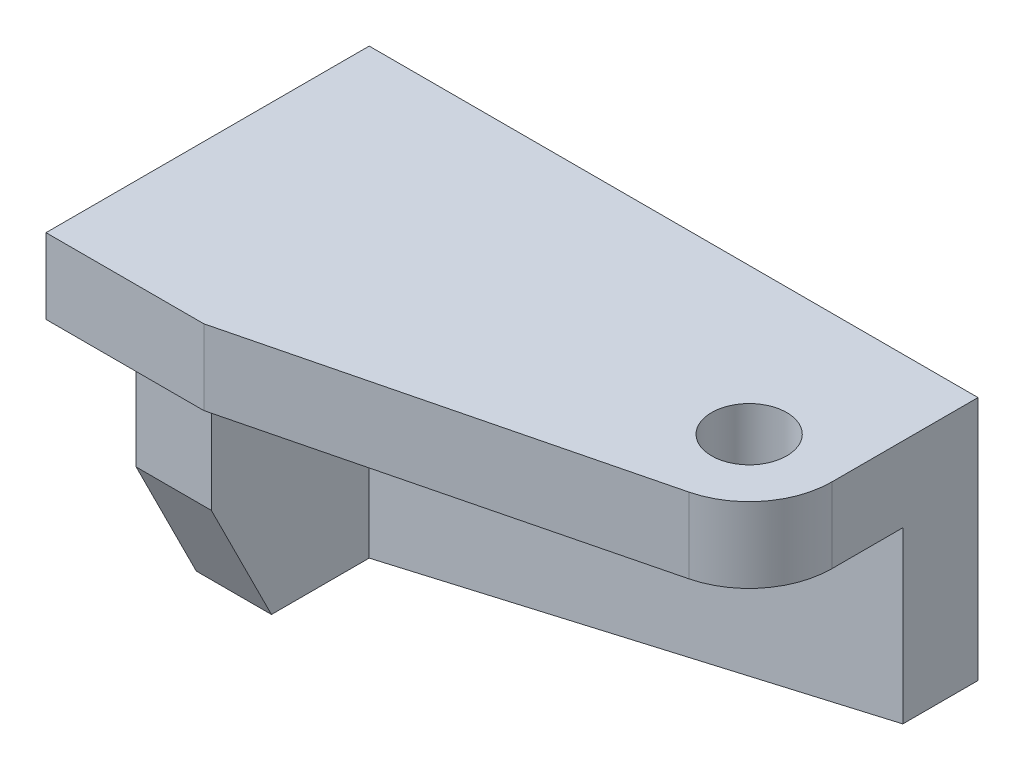
ISO-10303-21;
HEADER;
FILE_DESCRIPTION(('STEP AP214'),'2;1');
FILE_NAME('part.step','',(''),(''),'','','');
FILE_SCHEMA(('AUTOMOTIVE_DESIGN { 1 0 10303 214 1 1 1 1 }'));
ENDSEC;
DATA;
#1=APPLICATION_CONTEXT('core data for automotive mechanical design processes');
#2=APPLICATION_PROTOCOL_DEFINITION('international standard','automotive_design',2000,#1);
#3=PRODUCT_CONTEXT('',#1,'mechanical');
#4=PRODUCT('Part','Part','',(#3));
#5=PRODUCT_RELATED_PRODUCT_CATEGORY('part','',(#4));
#6=PRODUCT_DEFINITION_FORMATION('','',#4);
#7=PRODUCT_DEFINITION_CONTEXT('part definition',#1,'design');
#8=PRODUCT_DEFINITION('design','',#6,#7);
#9=PRODUCT_DEFINITION_SHAPE('','',#8);
#10=(LENGTH_UNIT() NAMED_UNIT(*) SI_UNIT(.MILLI.,.METRE.));
#11=(NAMED_UNIT(*) PLANE_ANGLE_UNIT() SI_UNIT($,.RADIAN.));
#12=(NAMED_UNIT(*) SI_UNIT($,.STERADIAN.) SOLID_ANGLE_UNIT());
#13=UNCERTAINTY_MEASURE_WITH_UNIT(LENGTH_MEASURE(1.E-05),#10,'distance_accuracy_value','');
#14=(GEOMETRIC_REPRESENTATION_CONTEXT(3) GLOBAL_UNCERTAINTY_ASSIGNED_CONTEXT((#13)) GLOBAL_UNIT_ASSIGNED_CONTEXT((#10,
#11,#12)) REPRESENTATION_CONTEXT('',''));
#15=CARTESIAN_POINT('',(0.,0.,0.));
#16=DIRECTION('',(0.,0.,1.));
#17=DIRECTION('',(1.,0.,0.));
#18=AXIS2_PLACEMENT_3D('',#15,#16,#17);
#19=CARTESIAN_POINT('',(71.,-22.6083584300847,10.));
#20=DIRECTION('',(-0.224951054343869,0.974370064785234,0.));
#21=DIRECTION('',(-0.974370064785234,-0.224951054343869,0.));
#22=AXIS2_PLACEMENT_3D('',#19,#20,#21);
#23=PLANE('',#22);
#24=DIRECTION('',(0.974370064785234,0.224951054343869,0.));
#25=VECTOR('',#24,1.);
#26=CARTESIAN_POINT('',(71.,-22.6083584300847,0.));
#27=LINE('',#26,#25);
#28=CARTESIAN_POINT('',(0.,-39.,0.));
#29=VERTEX_POINT('',#28);
#30=CARTESIAN_POINT('',(71.,-22.6083584300847,0.));
#31=VERTEX_POINT('',#30);
#32=EDGE_CURVE('E191',#29,#31,#27,.T.);
#33=ORIENTED_EDGE('',*,*,#32,.T.);
#34=DIRECTION('',(0.,0.,-1.));
#35=VECTOR('',#34,1.);
#36=CARTESIAN_POINT('',(71.,-22.6083584300847,10.));
#37=LINE('',#36,#35);
#38=CARTESIAN_POINT('',(71.,-22.6083584300847,10.));
#39=VERTEX_POINT('',#38);
#40=EDGE_CURVE('E48',#39,#31,#37,.T.);
#41=ORIENTED_EDGE('',*,*,#40,.F.);
#42=DIRECTION('',(0.974370064785234,0.224951054343869,0.));
#43=VECTOR('',#42,1.);
#44=CARTESIAN_POINT('',(71.,-22.6083584300847,10.));
#45=LINE('',#44,#43);
#46=CARTESIAN_POINT('',(0.,-39.,10.));
#47=VERTEX_POINT('',#46);
#48=EDGE_CURVE('E55',#47,#39,#45,.T.);
#49=ORIENTED_EDGE('',*,*,#48,.F.);
#50=DIRECTION('',(0.,0.,-1.));
#51=VECTOR('',#50,1.);
#52=CARTESIAN_POINT('',(0.,-39.,10.));
#53=LINE('',#52,#51);
#54=EDGE_CURVE('E11',#47,#29,#53,.T.);
#55=ORIENTED_EDGE('',*,*,#54,.T.);
#56=EDGE_LOOP('',(#33,#41,#49,#55));
#57=FACE_BOUND('',#56,.T.);
#58=ADVANCED_FACE('F39',(#57),#23,.F.);
#59=CARTESIAN_POINT('',(71.,0.,10.));
#60=DIRECTION('',(-1.,0.,0.));
#61=DIRECTION('',(0.,-1.,0.));
#62=AXIS2_PLACEMENT_3D('',#59,#60,#61);
#63=PLANE('',#62);
#64=DIRECTION('',(0.,1.,0.));
#65=VECTOR('',#64,1.);
#66=CARTESIAN_POINT('',(71.,0.,0.));
#67=LINE('',#66,#65);
#68=CARTESIAN_POINT('',(71.,10.,0.));
#69=VERTEX_POINT('',#68);
#70=EDGE_CURVE('E204',#31,#69,#67,.T.);
#71=ORIENTED_EDGE('',*,*,#70,.T.);
#72=DIRECTION('',(0.,0.,1.));
#73=VECTOR('',#72,1.);
#74=CARTESIAN_POINT('',(71.,10.,0.));
#75=LINE('',#74,#73);
#76=CARTESIAN_POINT('',(71.,10.,19.4461779378352));
#77=VERTEX_POINT('',#76);
#78=EDGE_CURVE('E135',#69,#77,#75,.T.);
#79=ORIENTED_EDGE('',*,*,#78,.T.);
#80=DIRECTION('',(0.,-1.,0.));
#81=VECTOR('',#80,1.);
#82=CARTESIAN_POINT('',(71.,10.,19.4461779378352));
#83=LINE('',#82,#81);
#84=CARTESIAN_POINT('',(71.,0.,19.4461779378352));
#85=VERTEX_POINT('',#84);
#86=EDGE_CURVE('E130',#77,#85,#83,.T.);
#87=ORIENTED_EDGE('',*,*,#86,.T.);
#88=DIRECTION('',(0.,0.,1.));
#89=VECTOR('',#88,1.);
#90=CARTESIAN_POINT('',(71.,0.,0.));
#91=LINE('',#90,#89);
#92=CARTESIAN_POINT('',(71.,0.,10.));
#93=VERTEX_POINT('',#92);
#94=EDGE_CURVE('E254',#93,#85,#91,.T.);
#95=ORIENTED_EDGE('',*,*,#94,.F.);
#96=DIRECTION('',(0.,1.,0.));
#97=VECTOR('',#96,1.);
#98=CARTESIAN_POINT('',(71.,0.,10.));
#99=LINE('',#98,#97);
#100=EDGE_CURVE('E207',#39,#93,#99,.T.);
#101=ORIENTED_EDGE('',*,*,#100,.F.);
#102=ORIENTED_EDGE('',*,*,#40,.T.);
#103=EDGE_LOOP('',(#71,#79,#87,#95,#101,#102));
#104=FACE_BOUND('',#103,.T.);
#105=ADVANCED_FACE('F223',(#104),#63,.F.);
#106=CARTESIAN_POINT('',(0.,0.,10.));
#107=DIRECTION('',(0.,0.,-1.));
#108=DIRECTION('',(-1.,0.,0.));
#109=AXIS2_PLACEMENT_3D('',#106,#107,#108);
#110=PLANE('',#109);
#111=DIRECTION('',(0.,-1.,0.));
#112=VECTOR('',#111,1.);
#113=CARTESIAN_POINT('',(0.,-39.,10.));
#114=LINE('',#113,#112);
#115=CARTESIAN_POINT('',(0.,0.,10.));
#116=VERTEX_POINT('',#115);
#117=EDGE_CURVE('E201',#116,#47,#114,.T.);
#118=ORIENTED_EDGE('',*,*,#117,.T.);
#119=ORIENTED_EDGE('',*,*,#48,.T.);
#120=ORIENTED_EDGE('',*,*,#100,.T.);
#121=DIRECTION('',(-1.,0.,0.));
#122=VECTOR('',#121,1.);
#123=CARTESIAN_POINT('',(0.,0.,10.));
#124=LINE('',#123,#122);
#125=EDGE_CURVE('E210',#93,#116,#124,.T.);
#126=ORIENTED_EDGE('',*,*,#125,.T.);
#127=EDGE_LOOP('',(#118,#119,#120,#126));
#128=FACE_BOUND('',#127,.T.);
#129=ADVANCED_FACE('F277',(#128),#110,.F.);
#130=CARTESIAN_POINT('',(0.,0.,0.));
#131=DIRECTION('',(0.,0.,-1.));
#132=DIRECTION('',(-1.,0.,0.));
#133=AXIS2_PLACEMENT_3D('',#130,#131,#132);
#134=PLANE('',#133);
#135=ORIENTED_EDGE('',*,*,#32,.F.);
#136=DIRECTION('',(1.,0.,0.));
#137=VECTOR('',#136,1.);
#138=CARTESIAN_POINT('',(-10.,-39.,0.));
#139=LINE('',#138,#137);
#140=CARTESIAN_POINT('',(-10.,-39.,0.));
#141=VERTEX_POINT('',#140);
#142=EDGE_CURVE('E188',#141,#29,#139,.T.);
#143=ORIENTED_EDGE('',*,*,#142,.F.);
#144=DIRECTION('',(0.,-1.,0.));
#145=VECTOR('',#144,1.);
#146=CARTESIAN_POINT('',(-10.,0.,0.));
#147=LINE('',#146,#145);
#148=CARTESIAN_POINT('',(-10.,10.,0.));
#149=VERTEX_POINT('',#148);
#150=EDGE_CURVE('E175',#149,#141,#147,.T.);
#151=ORIENTED_EDGE('',*,*,#150,.F.);
#152=DIRECTION('',(-1.,0.,0.));
#153=VECTOR('',#152,1.);
#154=CARTESIAN_POINT('',(0.,10.,0.));
#155=LINE('',#154,#153);
#156=EDGE_CURVE('E232',#69,#149,#155,.T.);
#157=ORIENTED_EDGE('',*,*,#156,.F.);
#158=ORIENTED_EDGE('',*,*,#70,.F.);
#159=EDGE_LOOP('',(#135,#143,#151,#157,#158));
#160=FACE_BOUND('',#159,.T.);
#161=ADVANCED_FACE('F229',(#160),#134,.T.);
#162=CARTESIAN_POINT('',(0.,0.,0.));
#163=DIRECTION('',(1.,0.,0.));
#164=DIRECTION('',(0.,0.,-1.));
#165=AXIS2_PLACEMENT_3D('',#162,#163,#164);
#166=PLANE('',#165);
#167=ORIENTED_EDGE('',*,*,#117,.F.);
#168=DIRECTION('',(0.,0.,1.));
#169=VECTOR('',#168,1.);
#170=CARTESIAN_POINT('',(0.,0.,0.));
#171=LINE('',#170,#169);
#172=CARTESIAN_POINT('',(0.,0.,31.));
#173=VERTEX_POINT('',#172);
#174=EDGE_CURVE('E153',#116,#173,#171,.T.);
#175=ORIENTED_EDGE('',*,*,#174,.T.);
#176=DIRECTION('',(0.,-1.,0.));
#177=VECTOR('',#176,1.);
#178=CARTESIAN_POINT('',(0.,0.,31.));
#179=LINE('',#178,#177);
#180=CARTESIAN_POINT('',(0.,-23.,31.));
#181=VERTEX_POINT('',#180);
#182=EDGE_CURVE('E158',#173,#181,#179,.T.);
#183=ORIENTED_EDGE('',*,*,#182,.T.);
#184=DIRECTION('',(0.,0.894427190999916,0.447213595499958));
#185=VECTOR('',#184,1.);
#186=CARTESIAN_POINT('',(0.,-39.,23.));
#187=LINE('',#186,#185);
#188=CARTESIAN_POINT('',(0.,-39.,23.));
#189=VERTEX_POINT('',#188);
#190=EDGE_CURVE('E182',#189,#181,#187,.T.);
#191=ORIENTED_EDGE('',*,*,#190,.F.);
#192=DIRECTION('',(0.,0.,1.));
#193=VECTOR('',#192,1.);
#194=CARTESIAN_POINT('',(0.,-39.,0.));
#195=LINE('',#194,#193);
#196=EDGE_CURVE('E169',#47,#189,#195,.T.);
#197=ORIENTED_EDGE('',*,*,#196,.F.);
#198=EDGE_LOOP('',(#167,#175,#183,#191,#197));
#199=FACE_BOUND('',#198,.T.);
#200=ADVANCED_FACE('F281',(#199),#166,.T.);
#201=CARTESIAN_POINT('',(-10.,-39.,0.));
#202=DIRECTION('',(0.,1.,0.));
#203=DIRECTION('',(0.,0.,1.));
#204=AXIS2_PLACEMENT_3D('',#201,#202,#203);
#205=PLANE('',#204);
#206=ORIENTED_EDGE('',*,*,#54,.F.);
#207=ORIENTED_EDGE('',*,*,#196,.T.);
#208=DIRECTION('',(1.,0.,0.));
#209=VECTOR('',#208,1.);
#210=CARTESIAN_POINT('',(-10.,-39.,23.));
#211=LINE('',#210,#209);
#212=CARTESIAN_POINT('',(-10.,-39.,23.));
#213=VERTEX_POINT('',#212);
#214=EDGE_CURVE('E192',#213,#189,#211,.T.);
#215=ORIENTED_EDGE('',*,*,#214,.F.);
#216=DIRECTION('',(0.,0.,1.));
#217=VECTOR('',#216,1.);
#218=CARTESIAN_POINT('',(-10.,-39.,0.));
#219=LINE('',#218,#217);
#220=EDGE_CURVE('E172',#141,#213,#219,.T.);
#221=ORIENTED_EDGE('',*,*,#220,.F.);
#222=ORIENTED_EDGE('',*,*,#142,.T.);
#223=EDGE_LOOP('',(#206,#207,#215,#221,#222));
#224=FACE_BOUND('',#223,.T.);
#225=ADVANCED_FACE('F286',(#224),#205,.F.);
#226=CARTESIAN_POINT('',(-10.,-39.,23.));
#227=DIRECTION('',(0.,0.447213595499958,-0.894427190999916));
#228=DIRECTION('',(0.,0.894427190999916,0.447213595499958));
#229=AXIS2_PLACEMENT_3D('',#226,#227,#228);
#230=PLANE('',#229);
#231=ORIENTED_EDGE('',*,*,#190,.T.);
#232=DIRECTION('',(1.,0.,0.));
#233=VECTOR('',#232,1.);
#234=CARTESIAN_POINT('',(-10.,-23.,31.));
#235=LINE('',#234,#233);
#236=CARTESIAN_POINT('',(-10.,-23.,31.));
#237=VERTEX_POINT('',#236);
#238=EDGE_CURVE('E196',#237,#181,#235,.T.);
#239=ORIENTED_EDGE('',*,*,#238,.F.);
#240=DIRECTION('',(0.,0.894427190999916,0.447213595499958));
#241=VECTOR('',#240,1.);
#242=CARTESIAN_POINT('',(-10.,-39.,23.));
#243=LINE('',#242,#241);
#244=EDGE_CURVE('E168',#213,#237,#243,.T.);
#245=ORIENTED_EDGE('',*,*,#244,.F.);
#246=ORIENTED_EDGE('',*,*,#214,.T.);
#247=EDGE_LOOP('',(#231,#239,#245,#246));
#248=FACE_BOUND('',#247,.T.);
#249=ADVANCED_FACE('F293',(#248),#230,.F.);
#250=CARTESIAN_POINT('',(-10.,0.,31.));
#251=DIRECTION('',(0.,0.,1.));
#252=DIRECTION('',(0.,-1.,0.));
#253=AXIS2_PLACEMENT_3D('',#250,#251,#252);
#254=PLANE('',#253);
#255=ORIENTED_EDGE('',*,*,#182,.F.);
#256=DIRECTION('',(1.,0.,0.));
#257=VECTOR('',#256,1.);
#258=CARTESIAN_POINT('',(-10.,0.,31.));
#259=LINE('',#258,#257);
#260=CARTESIAN_POINT('',(-9.99999999999999,0.,31.));
#261=VERTEX_POINT('',#260);
#262=EDGE_CURVE('E177',#261,#173,#259,.T.);
#263=ORIENTED_EDGE('',*,*,#262,.F.);
#264=DIRECTION('',(0.,-1.,0.));
#265=VECTOR('',#264,1.);
#266=CARTESIAN_POINT('',(-10.,0.,31.));
#267=LINE('',#266,#265);
#268=EDGE_CURVE('E164',#261,#237,#267,.T.);
#269=ORIENTED_EDGE('',*,*,#268,.T.);
#270=ORIENTED_EDGE('',*,*,#238,.T.);
#271=EDGE_LOOP('',(#255,#263,#269,#270));
#272=FACE_BOUND('',#271,.T.);
#273=ADVANCED_FACE('F295',(#272),#254,.T.);
#274=CARTESIAN_POINT('',(-10.,0.,0.));
#275=DIRECTION('',(1.,0.,0.));
#276=DIRECTION('',(0.,0.,-1.));
#277=AXIS2_PLACEMENT_3D('',#274,#275,#276);
#278=PLANE('',#277);
#279=ORIENTED_EDGE('',*,*,#268,.F.);
#280=DIRECTION('',(0.,0.,1.));
#281=VECTOR('',#280,1.);
#282=CARTESIAN_POINT('',(-10.,0.,0.));
#283=LINE('',#282,#281);
#284=CARTESIAN_POINT('',(-9.99999999999999,0.,43.));
#285=VERTEX_POINT('',#284);
#286=EDGE_CURVE('E257',#261,#285,#283,.T.);
#287=ORIENTED_EDGE('',*,*,#286,.T.);
#288=DIRECTION('',(0.,-1.,0.));
#289=VECTOR('',#288,1.);
#290=CARTESIAN_POINT('',(-9.99999999999999,10.,43.));
#291=LINE('',#290,#289);
#292=CARTESIAN_POINT('',(-9.99999999999999,10.,43.));
#293=VERTEX_POINT('',#292);
#294=EDGE_CURVE('E160',#293,#285,#291,.T.);
#295=ORIENTED_EDGE('',*,*,#294,.F.);
#296=DIRECTION('',(0.,0.,1.));
#297=VECTOR('',#296,1.);
#298=CARTESIAN_POINT('',(-10.,10.,0.));
#299=LINE('',#298,#297);
#300=EDGE_CURVE('E235',#149,#293,#299,.T.);
#301=ORIENTED_EDGE('',*,*,#300,.F.);
#302=ORIENTED_EDGE('',*,*,#150,.T.);
#303=ORIENTED_EDGE('',*,*,#220,.T.);
#304=ORIENTED_EDGE('',*,*,#244,.T.);
#305=EDGE_LOOP('',(#279,#287,#295,#301,#302,#303,#304));
#306=FACE_BOUND('',#305,.T.);
#307=ADVANCED_FACE('F290',(#306),#278,.F.);
#308=CARTESIAN_POINT('',(0.,0.,0.));
#309=DIRECTION('',(0.,1.,0.));
#310=DIRECTION('',(0.,0.,1.));
#311=AXIS2_PLACEMENT_3D('',#308,#309,#310);
#312=PLANE('',#311);
#313=CARTESIAN_POINT('',(60.,0.,19.4461779378352));
#314=DIRECTION('',(0.,1.,0.));
#315=DIRECTION('',(0.,0.,1.));
#316=AXIS2_PLACEMENT_3D('',#313,#314,#315);
#317=CIRCLE('',#316,5.);
#318=CARTESIAN_POINT('',(60.,0.,24.4461779378352));
#319=VERTEX_POINT('',#318);
#320=EDGE_CURVE('E147',#319,#319,#317,.T.);
#321=ORIENTED_EDGE('',*,*,#320,.T.);
#322=EDGE_LOOP('',(#321));
#323=FACE_BOUND('',#322,.T.);
#324=ORIENTED_EDGE('',*,*,#286,.F.);
#325=ORIENTED_EDGE('',*,*,#262,.T.);
#326=ORIENTED_EDGE('',*,*,#174,.F.);
#327=ORIENTED_EDGE('',*,*,#125,.F.);
#328=ORIENTED_EDGE('',*,*,#94,.T.);
#329=CARTESIAN_POINT('',(60.,0.,19.4461779378352));
#330=DIRECTION('',(0.,1.,0.));
#331=DIRECTION('',(0.,0.,1.));
#332=AXIS2_PLACEMENT_3D('',#329,#330,#331);
#333=CIRCLE('',#332,11.);
#334=CARTESIAN_POINT('',(62.6611408515964,0.,30.1194309268712));
#335=VERTEX_POINT('',#334);
#336=EDGE_CURVE('E251',#335,#85,#333,.T.);
#337=ORIENTED_EDGE('',*,*,#336,.F.);
#338=DIRECTION('',(0.970295726275996,0.,-0.241921895599669));
#339=VECTOR('',#338,1.);
#340=CARTESIAN_POINT('',(10.7374268391726,0.,43.0654668417893));
#341=LINE('',#340,#339);
#342=CARTESIAN_POINT('',(11.,0.,43.));
#343=VERTEX_POINT('',#342);
#344=EDGE_CURVE('E151',#343,#335,#341,.T.);
#345=ORIENTED_EDGE('',*,*,#344,.F.);
#346=DIRECTION('',(1.,0.,0.));
#347=VECTOR('',#346,1.);
#348=CARTESIAN_POINT('',(0.,0.,43.));
#349=LINE('',#348,#347);
#350=EDGE_CURVE('E260',#285,#343,#349,.T.);
#351=ORIENTED_EDGE('',*,*,#350,.F.);
#352=EDGE_LOOP('',(#324,#325,#326,#327,#328,#337,#345,#351));
#353=FACE_BOUND('',#352,.T.);
#354=ADVANCED_FACE('F275',(#323,#353),#312,.F.);
#355=CARTESIAN_POINT('',(10.7374268391726,10.,43.0654668417893));
#356=DIRECTION('',(-0.241921895599669,0.,-0.970295726275996));
#357=DIRECTION('',(-0.970295726275996,0.,0.241921895599669));
#358=AXIS2_PLACEMENT_3D('',#355,#356,#357);
#359=PLANE('',#358);
#360=ORIENTED_EDGE('',*,*,#344,.T.);
#361=DIRECTION('',(0.,-1.,0.));
#362=VECTOR('',#361,1.);
#363=CARTESIAN_POINT('',(62.6611408515964,10.,30.1194309268712));
#364=LINE('',#363,#362);
#365=CARTESIAN_POINT('',(62.6611408515964,10.,30.1194309268712));
#366=VERTEX_POINT('',#365);
#367=EDGE_CURVE('E127',#366,#335,#364,.T.);
#368=ORIENTED_EDGE('',*,*,#367,.F.);
#369=DIRECTION('',(0.970295726275996,0.,-0.241921895599669));
#370=VECTOR('',#369,1.);
#371=CARTESIAN_POINT('',(10.7374268391726,10.,43.0654668417893));
#372=LINE('',#371,#370);
#373=CARTESIAN_POINT('',(11.,10.,43.));
#374=VERTEX_POINT('',#373);
#375=EDGE_CURVE('E136',#374,#366,#372,.T.);
#376=ORIENTED_EDGE('',*,*,#375,.F.);
#377=DIRECTION('',(0.,-1.,0.));
#378=VECTOR('',#377,1.);
#379=CARTESIAN_POINT('',(11.,10.,43.));
#380=LINE('',#379,#378);
#381=EDGE_CURVE('E248',#374,#343,#380,.T.);
#382=ORIENTED_EDGE('',*,*,#381,.T.);
#383=EDGE_LOOP('',(#360,#368,#376,#382));
#384=FACE_BOUND('',#383,.T.);
#385=ADVANCED_FACE('F149',(#384),#359,.F.);
#386=CARTESIAN_POINT('',(60.,10.,19.4461779378352));
#387=DIRECTION('',(0.,-1.,0.));
#388=DIRECTION('',(0.,0.,-1.));
#389=AXIS2_PLACEMENT_3D('',#386,#387,#388);
#390=CYLINDRICAL_SURFACE('',#389,11.);
#391=ORIENTED_EDGE('',*,*,#336,.T.);
#392=ORIENTED_EDGE('',*,*,#86,.F.);
#393=CARTESIAN_POINT('',(60.,10.,19.4461779378352));
#394=DIRECTION('',(0.,1.,0.));
#395=DIRECTION('',(0.,0.,1.));
#396=AXIS2_PLACEMENT_3D('',#393,#394,#395);
#397=CIRCLE('',#396,11.);
#398=EDGE_CURVE('E122',#366,#77,#397,.T.);
#399=ORIENTED_EDGE('',*,*,#398,.F.);
#400=ORIENTED_EDGE('',*,*,#367,.T.);
#401=EDGE_LOOP('',(#391,#392,#399,#400));
#402=FACE_BOUND('',#401,.T.);
#403=ADVANCED_FACE('F125',(#402),#390,.T.);
#404=CARTESIAN_POINT('',(0.,10.,43.));
#405=DIRECTION('',(0.,0.,-1.));
#406=DIRECTION('',(-1.,0.,0.));
#407=AXIS2_PLACEMENT_3D('',#404,#405,#406);
#408=PLANE('',#407);
#409=ORIENTED_EDGE('',*,*,#350,.T.);
#410=ORIENTED_EDGE('',*,*,#381,.F.);
#411=DIRECTION('',(1.,0.,0.));
#412=VECTOR('',#411,1.);
#413=CARTESIAN_POINT('',(0.,10.,43.));
#414=LINE('',#413,#412);
#415=EDGE_CURVE('E142',#293,#374,#414,.T.);
#416=ORIENTED_EDGE('',*,*,#415,.F.);
#417=ORIENTED_EDGE('',*,*,#294,.T.);
#418=EDGE_LOOP('',(#409,#410,#416,#417));
#419=FACE_BOUND('',#418,.T.);
#420=ADVANCED_FACE('F272',(#419),#408,.F.);
#421=CARTESIAN_POINT('',(60.,10.,19.4461779378352));
#422=DIRECTION('',(0.,-1.,0.));
#423=DIRECTION('',(0.,0.,-1.));
#424=AXIS2_PLACEMENT_3D('',#421,#422,#423);
#425=CYLINDRICAL_SURFACE('',#424,5.);
#426=CARTESIAN_POINT('',(60.,10.,19.4461779378352));
#427=DIRECTION('',(0.,1.,0.));
#428=DIRECTION('',(0.,0.,1.));
#429=AXIS2_PLACEMENT_3D('',#426,#427,#428);
#430=CIRCLE('',#429,5.);
#431=CARTESIAN_POINT('',(60.,10.,24.4461779378352));
#432=VERTEX_POINT('',#431);
#433=EDGE_CURVE('E244',#432,#432,#430,.T.);
#434=ORIENTED_EDGE('',*,*,#433,.T.);
#435=EDGE_LOOP('',(#434));
#436=FACE_BOUND('',#435,.T.);
#437=ORIENTED_EDGE('',*,*,#320,.F.);
#438=EDGE_LOOP('',(#437));
#439=FACE_BOUND('',#438,.T.);
#440=ADVANCED_FACE('F329',(#436,#439),#425,.F.);
#441=CARTESIAN_POINT('',(0.,10.,0.));
#442=DIRECTION('',(0.,1.,0.));
#443=DIRECTION('',(0.,0.,1.));
#444=AXIS2_PLACEMENT_3D('',#441,#442,#443);
#445=PLANE('',#444);
#446=ORIENTED_EDGE('',*,*,#375,.T.);
#447=ORIENTED_EDGE('',*,*,#398,.T.);
#448=ORIENTED_EDGE('',*,*,#78,.F.);
#449=ORIENTED_EDGE('',*,*,#156,.T.);
#450=ORIENTED_EDGE('',*,*,#300,.T.);
#451=ORIENTED_EDGE('',*,*,#415,.T.);
#452=EDGE_LOOP('',(#446,#447,#448,#449,#450,#451));
#453=FACE_BOUND('',#452,.T.);
#454=ORIENTED_EDGE('',*,*,#433,.F.);
#455=EDGE_LOOP('',(#454));
#456=FACE_BOUND('',#455,.T.);
#457=ADVANCED_FACE('F139',(#453,#456),#445,.T.);
#458=CLOSED_SHELL('',(#58,#105,#129,#161,#200,#225,#249,#273,#307,#354,#385,#403,#420,#440,#457));
#459=MANIFOLD_SOLID_BREP('B2',#458);
#460=ADVANCED_BREP_SHAPE_REPRESENTATION('',(#18,#459),#14);
#461=SHAPE_DEFINITION_REPRESENTATION(#9,#460);
ENDSEC;
END-ISO-10303-21;
